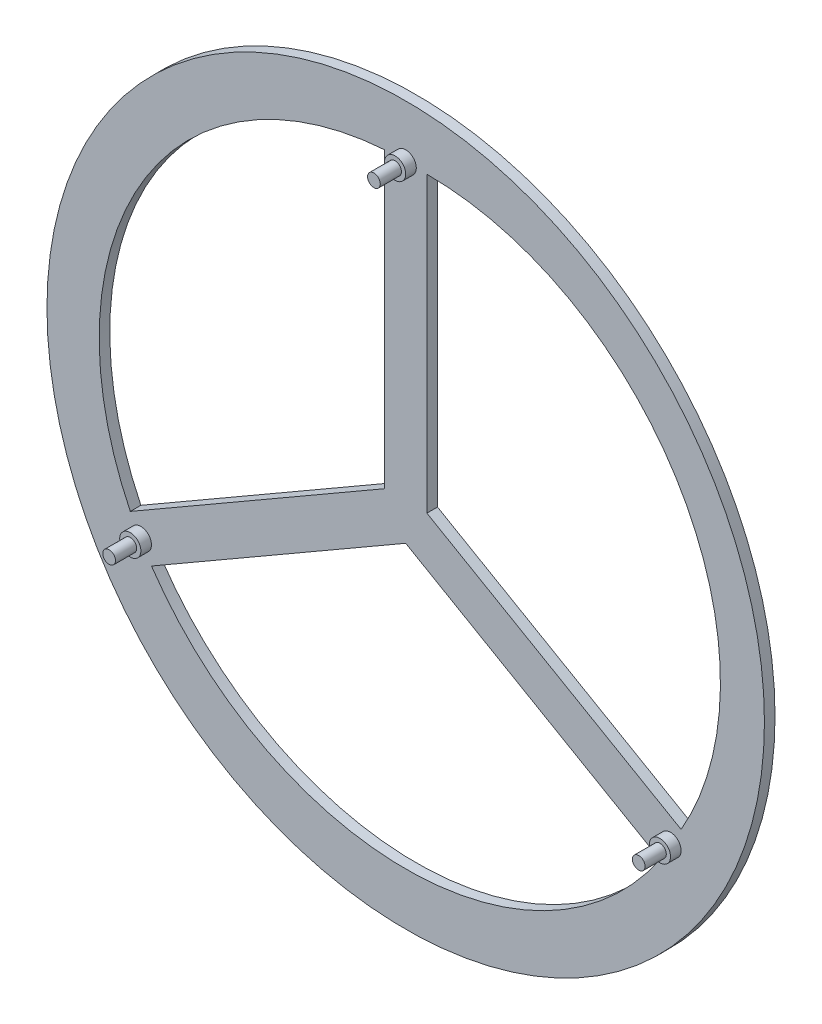
ISO-10303-21;
HEADER;
FILE_DESCRIPTION(('STEP AP214'),'2;1');
FILE_NAME('part.step','',(''),(''),'','','');
FILE_SCHEMA(('AUTOMOTIVE_DESIGN { 1 0 10303 214 1 1 1 1 }'));
ENDSEC;
DATA;
#1=APPLICATION_CONTEXT('core data for automotive mechanical design processes');
#2=APPLICATION_PROTOCOL_DEFINITION('international standard','automotive_design',2000,#1);
#3=PRODUCT_CONTEXT('',#1,'mechanical');
#4=PRODUCT('Part','Part','',(#3));
#5=PRODUCT_RELATED_PRODUCT_CATEGORY('part','',(#4));
#6=PRODUCT_DEFINITION_FORMATION('','',#4);
#7=PRODUCT_DEFINITION_CONTEXT('part definition',#1,'design');
#8=PRODUCT_DEFINITION('design','',#6,#7);
#9=PRODUCT_DEFINITION_SHAPE('','',#8);
#10=(LENGTH_UNIT() NAMED_UNIT(*) SI_UNIT(.MILLI.,.METRE.));
#11=(NAMED_UNIT(*) PLANE_ANGLE_UNIT() SI_UNIT($,.RADIAN.));
#12=(NAMED_UNIT(*) SI_UNIT($,.STERADIAN.) SOLID_ANGLE_UNIT());
#13=UNCERTAINTY_MEASURE_WITH_UNIT(LENGTH_MEASURE(1.E-05),#10,'distance_accuracy_value','');
#14=(GEOMETRIC_REPRESENTATION_CONTEXT(3) GLOBAL_UNCERTAINTY_ASSIGNED_CONTEXT((#13)) GLOBAL_UNIT_ASSIGNED_CONTEXT((#10,
#11,#12)) REPRESENTATION_CONTEXT('',''));
#15=CARTESIAN_POINT('',(0.,0.,0.));
#16=DIRECTION('',(0.,0.,1.));
#17=DIRECTION('',(1.,0.,0.));
#18=AXIS2_PLACEMENT_3D('',#15,#16,#17);
#19=CARTESIAN_POINT('',(-135.538575845274,234.759699749543,10.));
#20=DIRECTION('',(0.5,-0.866025403784439,0.));
#21=DIRECTION('',(0.866025403784439,0.5,0.));
#22=AXIS2_PLACEMENT_3D('',#19,#20,#21);
#23=PLANE('',#22);
#24=DIRECTION('',(-0.866025403784439,-0.5,0.));
#25=VECTOR('',#24,1.);
#26=CARTESIAN_POINT('',(-135.538575845274,234.759699749543,0.));
#27=LINE('',#26,#25);
#28=CARTESIAN_POINT('',(-41.9944651266869,288.767417254023,0.));
#29=VERTEX_POINT('',#28);
#30=CARTESIAN_POINT('',(-281.994465126687,150.203352648513,0.));
#31=VERTEX_POINT('',#30);
#32=EDGE_CURVE('E125',#29,#31,#27,.T.);
#33=ORIENTED_EDGE('',*,*,#32,.T.);
#34=DIRECTION('',(0.,0.,-1.));
#35=VECTOR('',#34,1.);
#36=CARTESIAN_POINT('',(-281.994465126687,150.203352648513,10.));
#37=LINE('',#36,#35);
#38=CARTESIAN_POINT('',(-281.994465126687,150.203352648513,10.));
#39=VERTEX_POINT('',#38);
#40=EDGE_CURVE('E11',#39,#31,#37,.T.);
#41=ORIENTED_EDGE('',*,*,#40,.F.);
#42=DIRECTION('',(-0.866025403784439,-0.5,0.));
#43=VECTOR('',#42,1.);
#44=CARTESIAN_POINT('',(-135.538575845274,234.759699749543,10.));
#45=LINE('',#44,#43);
#46=CARTESIAN_POINT('',(-41.9944651266869,288.767417254023,10.));
#47=VERTEX_POINT('',#46);
#48=EDGE_CURVE('E120',#47,#39,#45,.T.);
#49=ORIENTED_EDGE('',*,*,#48,.F.);
#50=DIRECTION('',(0.,0.,-1.));
#51=VECTOR('',#50,1.);
#52=CARTESIAN_POINT('',(-41.9944651266869,288.767417254023,10.));
#53=LINE('',#52,#51);
#54=EDGE_CURVE('E54',#47,#29,#53,.T.);
#55=ORIENTED_EDGE('',*,*,#54,.T.);
#56=EDGE_LOOP('',(#33,#41,#49,#55));
#57=FACE_BOUND('',#56,.T.);
#58=ADVANCED_FACE('F35',(#57),#23,.F.);
#59=CARTESIAN_POINT('',(-21.9944651266869,277.220411870231,10.));
#60=DIRECTION('',(0.,0.,-1.));
#61=DIRECTION('',(-1.,0.,0.));
#62=AXIS2_PLACEMENT_3D('',#59,#60,#61);
#63=CYLINDRICAL_SURFACE('',#62,289.367125522809);
#64=CARTESIAN_POINT('',(-21.9944651266869,277.220411870231,0.));
#65=DIRECTION('',(0.,0.,1.));
#66=DIRECTION('',(1.,0.,0.));
#67=AXIS2_PLACEMENT_3D('',#64,#65,#66);
#68=CIRCLE('',#67,289.367125522809);
#69=CARTESIAN_POINT('',(-41.9944651266869,565.895546465044,0.));
#70=VERTEX_POINT('',#69);
#71=EDGE_CURVE('E128',#31,#70,#68,.F.);
#72=ORIENTED_EDGE('',*,*,#71,.T.);
#73=DIRECTION('',(0.,0.,-1.));
#74=VECTOR('',#73,1.);
#75=CARTESIAN_POINT('',(-41.9944651266869,565.895546465044,10.));
#76=LINE('',#75,#74);
#77=CARTESIAN_POINT('',(-41.9944651266869,565.895546465044,10.));
#78=VERTEX_POINT('',#77);
#79=EDGE_CURVE('E45',#78,#70,#76,.T.);
#80=ORIENTED_EDGE('',*,*,#79,.F.);
#81=CARTESIAN_POINT('',(-21.9944651266869,277.220411870231,10.));
#82=DIRECTION('',(0.,0.,1.));
#83=DIRECTION('',(1.,0.,0.));
#84=AXIS2_PLACEMENT_3D('',#81,#82,#83);
#85=CIRCLE('',#84,289.367125522809);
#86=EDGE_CURVE('E113',#39,#78,#85,.F.);
#87=ORIENTED_EDGE('',*,*,#86,.F.);
#88=ORIENTED_EDGE('',*,*,#40,.T.);
#89=EDGE_LOOP('',(#72,#80,#87,#88));
#90=FACE_BOUND('',#89,.T.);
#91=ADVANCED_FACE('F115',(#90),#63,.F.);
#92=CARTESIAN_POINT('',(-1.99446512668691,288.767417254023,10.));
#93=DIRECTION('',(0.,0.,-1.));
#94=DIRECTION('',(-1.,0.,0.));
#95=AXIS2_PLACEMENT_3D('',#92,#93,#94);
#96=CYLINDRICAL_SURFACE('',#95,277.12812921102);
#97=CARTESIAN_POINT('',(-1.99446512668691,288.767417254023,0.));
#98=DIRECTION('',(0.,0.,1.));
#99=DIRECTION('',(1.,0.,0.));
#100=AXIS2_PLACEMENT_3D('',#97,#98,#99);
#101=CIRCLE('',#100,277.12812921102);
#102=CARTESIAN_POINT('',(238.005534873313,150.203352648513,0.));
#103=VERTEX_POINT('',#102);
#104=CARTESIAN_POINT('',(-1.99446512668691,565.895546465044,0.));
#105=VERTEX_POINT('',#104);
#106=EDGE_CURVE('E213',#103,#105,#101,.T.);
#107=ORIENTED_EDGE('',*,*,#106,.F.);
#108=DIRECTION('',(0.,0.,-1.));
#109=VECTOR('',#108,1.);
#110=CARTESIAN_POINT('',(238.005534873313,150.203352648513,10.));
#111=LINE('',#110,#109);
#112=CARTESIAN_POINT('',(238.005534873313,150.203352648513,10.));
#113=VERTEX_POINT('',#112);
#114=EDGE_CURVE('E141',#113,#103,#111,.T.);
#115=ORIENTED_EDGE('',*,*,#114,.F.);
#116=CARTESIAN_POINT('',(-1.99446512668691,288.767417254023,10.));
#117=DIRECTION('',(0.,0.,1.));
#118=DIRECTION('',(1.,0.,0.));
#119=AXIS2_PLACEMENT_3D('',#116,#117,#118);
#120=CIRCLE('',#119,277.12812921102);
#121=CARTESIAN_POINT('',(-1.99446512668691,565.895546465044,10.));
#122=VERTEX_POINT('',#121);
#123=EDGE_CURVE('E194',#113,#122,#120,.T.);
#124=ORIENTED_EDGE('',*,*,#123,.T.);
#125=DIRECTION('',(0.,0.,-1.));
#126=VECTOR('',#125,1.);
#127=CARTESIAN_POINT('',(-1.99446512668691,565.895546465044,10.));
#128=LINE('',#127,#126);
#129=EDGE_CURVE('E143',#122,#105,#128,.T.);
#130=ORIENTED_EDGE('',*,*,#129,.T.);
#131=EDGE_LOOP('',(#107,#115,#124,#130));
#132=FACE_BOUND('',#131,.T.);
#133=ADVANCED_FACE('F230',(#132),#96,.F.);
#134=CARTESIAN_POINT('',(124.541343281931,215.711934207181,10.));
#135=DIRECTION('',(0.5,0.866025403784439,0.));
#136=DIRECTION('',(-0.866025403784439,0.5,0.));
#137=AXIS2_PLACEMENT_3D('',#134,#135,#136);
#138=PLANE('',#137);
#139=DIRECTION('',(0.866025403784439,-0.5,0.));
#140=VECTOR('',#139,1.);
#141=CARTESIAN_POINT('',(124.541343281931,215.711934207181,0.));
#142=LINE('',#141,#140);
#143=CARTESIAN_POINT('',(-1.99446512668691,288.767417254023,0.));
#144=VERTEX_POINT('',#143);
#145=EDGE_CURVE('E216',#144,#103,#142,.T.);
#146=ORIENTED_EDGE('',*,*,#145,.F.);
#147=DIRECTION('',(0.,0.,-1.));
#148=VECTOR('',#147,1.);
#149=CARTESIAN_POINT('',(-1.99446512668691,288.767417254023,10.));
#150=LINE('',#149,#148);
#151=CARTESIAN_POINT('',(-1.99446512668691,288.767417254023,10.));
#152=VERTEX_POINT('',#151);
#153=EDGE_CURVE('E145',#152,#144,#150,.T.);
#154=ORIENTED_EDGE('',*,*,#153,.F.);
#155=DIRECTION('',(0.866025403784439,-0.5,0.));
#156=VECTOR('',#155,1.);
#157=CARTESIAN_POINT('',(124.541343281931,215.711934207181,10.));
#158=LINE('',#157,#156);
#159=EDGE_CURVE('E197',#152,#113,#158,.T.);
#160=ORIENTED_EDGE('',*,*,#159,.T.);
#161=ORIENTED_EDGE('',*,*,#114,.T.);
#162=EDGE_LOOP('',(#146,#154,#160,#161));
#163=FACE_BOUND('',#162,.T.);
#164=ADVANCED_FACE('F236',(#163),#138,.T.);
#165=CARTESIAN_POINT('',(-21.9944651266869,277.220411870231,10.));
#166=DIRECTION('',(0.,0.,-1.));
#167=DIRECTION('',(-1.,0.,0.));
#168=AXIS2_PLACEMENT_3D('',#165,#166,#167);
#169=CYLINDRICAL_SURFACE('',#168,289.367125522809);
#170=CARTESIAN_POINT('',(-21.9944651266869,277.220411870231,0.));
#171=DIRECTION('',(0.,0.,1.));
#172=DIRECTION('',(1.,0.,0.));
#173=AXIS2_PLACEMENT_3D('',#170,#171,#172);
#174=CIRCLE('',#173,289.367125522809);
#175=CARTESIAN_POINT('',(-261.994465126687,115.562336497136,0.));
#176=VERTEX_POINT('',#175);
#177=CARTESIAN_POINT('',(218.005534873313,115.562336497136,0.));
#178=VERTEX_POINT('',#177);
#179=EDGE_CURVE('E187',#176,#178,#174,.T.);
#180=ORIENTED_EDGE('',*,*,#179,.F.);
#181=DIRECTION('',(0.,0.,-1.));
#182=VECTOR('',#181,1.);
#183=CARTESIAN_POINT('',(-261.994465126687,115.562336497136,10.));
#184=LINE('',#183,#182);
#185=CARTESIAN_POINT('',(-261.994465126687,115.562336497136,10.));
#186=VERTEX_POINT('',#185);
#187=EDGE_CURVE('E95',#186,#176,#184,.T.);
#188=ORIENTED_EDGE('',*,*,#187,.F.);
#189=CARTESIAN_POINT('',(-21.9944651266869,277.220411870231,10.));
#190=DIRECTION('',(0.,0.,1.));
#191=DIRECTION('',(1.,0.,0.));
#192=AXIS2_PLACEMENT_3D('',#189,#190,#191);
#193=CIRCLE('',#192,289.367125522809);
#194=CARTESIAN_POINT('',(218.005534873313,115.562336497136,10.));
#195=VERTEX_POINT('',#194);
#196=EDGE_CURVE('E139',#186,#195,#193,.T.);
#197=ORIENTED_EDGE('',*,*,#196,.T.);
#198=DIRECTION('',(0.,0.,-1.));
#199=VECTOR('',#198,1.);
#200=CARTESIAN_POINT('',(218.005534873313,115.562336497136,10.));
#201=LINE('',#200,#199);
#202=EDGE_CURVE('E148',#195,#178,#201,.T.);
#203=ORIENTED_EDGE('',*,*,#202,.T.);
#204=EDGE_LOOP('',(#180,#188,#197,#203));
#205=FACE_BOUND('',#204,.T.);
#206=ADVANCED_FACE('F37',(#205),#169,.F.);
#207=CARTESIAN_POINT('',(-115.538575845274,200.118683598165,10.));
#208=DIRECTION('',(0.5,-0.866025403784438,0.));
#209=DIRECTION('',(0.866025403784439,0.5,0.));
#210=AXIS2_PLACEMENT_3D('',#207,#208,#209);
#211=PLANE('',#210);
#212=DIRECTION('',(-0.866025403784439,-0.5,0.));
#213=VECTOR('',#212,1.);
#214=CARTESIAN_POINT('',(-115.538575845274,200.118683598165,0.));
#215=LINE('',#214,#213);
#216=CARTESIAN_POINT('',(-21.9944651266869,254.126401102646,0.));
#217=VERTEX_POINT('',#216);
#218=EDGE_CURVE('E207',#217,#176,#215,.T.);
#219=ORIENTED_EDGE('',*,*,#218,.F.);
#220=DIRECTION('',(0.,0.,-1.));
#221=VECTOR('',#220,1.);
#222=CARTESIAN_POINT('',(-21.9944651266869,254.126401102646,10.));
#223=LINE('',#222,#221);
#224=CARTESIAN_POINT('',(-21.9944651266869,254.126401102646,10.));
#225=VERTEX_POINT('',#224);
#226=EDGE_CURVE('E150',#225,#217,#223,.T.);
#227=ORIENTED_EDGE('',*,*,#226,.F.);
#228=DIRECTION('',(-0.866025403784439,-0.5,0.));
#229=VECTOR('',#228,1.);
#230=CARTESIAN_POINT('',(-115.538575845274,200.118683598165,10.));
#231=LINE('',#230,#229);
#232=EDGE_CURVE('E189',#225,#186,#231,.T.);
#233=ORIENTED_EDGE('',*,*,#232,.T.);
#234=ORIENTED_EDGE('',*,*,#187,.T.);
#235=EDGE_LOOP('',(#219,#227,#233,#234));
#236=FACE_BOUND('',#235,.T.);
#237=ADVANCED_FACE('F243',(#236),#211,.T.);
#238=CARTESIAN_POINT('',(-21.9944651266869,277.220411870231,10.));
#239=DIRECTION('',(0.,0.,-1.));
#240=DIRECTION('',(-1.,0.,0.));
#241=AXIS2_PLACEMENT_3D('',#238,#239,#240);
#242=CYLINDRICAL_SURFACE('',#241,338.675134594814);
#243=CARTESIAN_POINT('',(-21.9944651266869,277.220411870231,10.));
#244=DIRECTION('',(0.,0.,1.));
#245=DIRECTION('',(1.,0.,0.));
#246=AXIS2_PLACEMENT_3D('',#243,#244,#245);
#247=CIRCLE('',#246,338.675134594814);
#248=CARTESIAN_POINT('',(316.680669468127,277.220411870231,10.));
#249=VERTEX_POINT('',#248);
#250=EDGE_CURVE('E123',#249,#249,#247,.T.);
#251=ORIENTED_EDGE('',*,*,#250,.F.);
#252=EDGE_LOOP('',(#251));
#253=FACE_BOUND('',#252,.T.);
#254=CARTESIAN_POINT('',(-21.9944651266869,277.220411870231,0.));
#255=DIRECTION('',(0.,0.,1.));
#256=DIRECTION('',(1.,0.,0.));
#257=AXIS2_PLACEMENT_3D('',#254,#255,#256);
#258=CIRCLE('',#257,338.675134594814);
#259=CARTESIAN_POINT('',(316.680669468127,277.220411870231,0.));
#260=VERTEX_POINT('',#259);
#261=EDGE_CURVE('E129',#260,#260,#258,.T.);
#262=ORIENTED_EDGE('',*,*,#261,.T.);
#263=EDGE_LOOP('',(#262));
#264=FACE_BOUND('',#263,.T.);
#265=ADVANCED_FACE('F254',(#253,#264),#242,.T.);
#266=CARTESIAN_POINT('',(-1.99446512668691,0.,10.));
#267=DIRECTION('',(-1.,0.,0.));
#268=DIRECTION('',(0.,0.,1.));
#269=AXIS2_PLACEMENT_3D('',#266,#267,#268);
#270=PLANE('',#269);
#271=DIRECTION('',(0.,1.,0.));
#272=VECTOR('',#271,1.);
#273=CARTESIAN_POINT('',(-1.99446512668691,0.,0.));
#274=LINE('',#273,#272);
#275=EDGE_CURVE('E134',#144,#105,#274,.T.);
#276=ORIENTED_EDGE('',*,*,#275,.T.);
#277=ORIENTED_EDGE('',*,*,#129,.F.);
#278=DIRECTION('',(0.,1.,0.));
#279=VECTOR('',#278,1.);
#280=CARTESIAN_POINT('',(-1.99446512668691,0.,10.));
#281=LINE('',#280,#279);
#282=EDGE_CURVE('E200',#152,#122,#281,.T.);
#283=ORIENTED_EDGE('',*,*,#282,.F.);
#284=ORIENTED_EDGE('',*,*,#153,.T.);
#285=EDGE_LOOP('',(#276,#277,#283,#284));
#286=FACE_BOUND('',#285,.T.);
#287=ADVANCED_FACE('F222',(#286),#270,.F.);
#288=CARTESIAN_POINT('',(104.541343281931,181.070918055803,10.));
#289=DIRECTION('',(0.5,0.866025403784438,0.));
#290=DIRECTION('',(-0.866025403784439,0.5,0.));
#291=AXIS2_PLACEMENT_3D('',#288,#289,#290);
#292=PLANE('',#291);
#293=DIRECTION('',(0.866025403784439,-0.5,0.));
#294=VECTOR('',#293,1.);
#295=CARTESIAN_POINT('',(104.541343281931,181.070918055803,0.));
#296=LINE('',#295,#294);
#297=EDGE_CURVE('E210',#217,#178,#296,.T.);
#298=ORIENTED_EDGE('',*,*,#297,.T.);
#299=ORIENTED_EDGE('',*,*,#202,.F.);
#300=DIRECTION('',(0.866025403784439,-0.5,0.));
#301=VECTOR('',#300,1.);
#302=CARTESIAN_POINT('',(104.541343281931,181.070918055803,10.));
#303=LINE('',#302,#301);
#304=EDGE_CURVE('E192',#225,#195,#303,.T.);
#305=ORIENTED_EDGE('',*,*,#304,.F.);
#306=ORIENTED_EDGE('',*,*,#226,.T.);
#307=EDGE_LOOP('',(#298,#299,#305,#306));
#308=FACE_BOUND('',#307,.T.);
#309=ADVANCED_FACE('F258',(#308),#292,.F.);
#310=CARTESIAN_POINT('',(-41.9944651266869,0.,10.));
#311=DIRECTION('',(-1.,0.,0.));
#312=DIRECTION('',(0.,0.,1.));
#313=AXIS2_PLACEMENT_3D('',#310,#311,#312);
#314=PLANE('',#313);
#315=DIRECTION('',(0.,1.,0.));
#316=VECTOR('',#315,1.);
#317=CARTESIAN_POINT('',(-41.9944651266869,0.,0.));
#318=LINE('',#317,#316);
#319=EDGE_CURVE('E131',#29,#70,#318,.T.);
#320=ORIENTED_EDGE('',*,*,#319,.F.);
#321=ORIENTED_EDGE('',*,*,#54,.F.);
#322=DIRECTION('',(0.,1.,0.));
#323=VECTOR('',#322,1.);
#324=CARTESIAN_POINT('',(-41.9944651266869,0.,10.));
#325=LINE('',#324,#323);
#326=EDGE_CURVE('E119',#47,#78,#325,.T.);
#327=ORIENTED_EDGE('',*,*,#326,.T.);
#328=ORIENTED_EDGE('',*,*,#79,.T.);
#329=EDGE_LOOP('',(#320,#321,#327,#328));
#330=FACE_BOUND('',#329,.T.);
#331=ADVANCED_FACE('F262',(#330),#314,.T.);
#332=CARTESIAN_POINT('',(0.,0.,10.));
#333=DIRECTION('',(0.,0.,1.));
#334=DIRECTION('',(1.,0.,0.));
#335=AXIS2_PLACEMENT_3D('',#332,#333,#334);
#336=PLANE('',#335);
#337=CARTESIAN_POINT('',(-271.994465126687,132.882844572824,10.));
#338=DIRECTION('',(0.,0.,1.));
#339=DIRECTION('',(1.,0.,0.));
#340=AXIS2_PLACEMENT_3D('',#337,#338,#339);
#341=CIRCLE('',#340,10.);
#342=CARTESIAN_POINT('',(-261.994465126687,132.882844572824,10.));
#343=VERTEX_POINT('',#342);
#344=EDGE_CURVE('E166',#343,#343,#341,.F.);
#345=ORIENTED_EDGE('',*,*,#344,.T.);
#346=EDGE_LOOP('',(#345));
#347=FACE_BOUND('',#346,.T.);
#348=CARTESIAN_POINT('',(228.005534873313,132.882844572824,10.));
#349=DIRECTION('',(0.,0.,1.));
#350=DIRECTION('',(1.,0.,0.));
#351=AXIS2_PLACEMENT_3D('',#348,#349,#350);
#352=CIRCLE('',#351,10.);
#353=CARTESIAN_POINT('',(238.005534873313,132.882844572824,10.));
#354=VERTEX_POINT('',#353);
#355=EDGE_CURVE('E159',#354,#354,#352,.F.);
#356=ORIENTED_EDGE('',*,*,#355,.T.);
#357=EDGE_LOOP('',(#356));
#358=FACE_BOUND('',#357,.T.);
#359=CARTESIAN_POINT('',(-21.9944651266869,565.895546465044,10.));
#360=DIRECTION('',(0.,0.,1.));
#361=DIRECTION('',(1.,0.,0.));
#362=AXIS2_PLACEMENT_3D('',#359,#360,#361);
#363=CIRCLE('',#362,10.);
#364=CARTESIAN_POINT('',(-11.9944651266869,565.895546465044,10.));
#365=VERTEX_POINT('',#364);
#366=EDGE_CURVE('E155',#365,#365,#363,.F.);
#367=ORIENTED_EDGE('',*,*,#366,.T.);
#368=EDGE_LOOP('',(#367));
#369=FACE_BOUND('',#368,.T.);
#370=ORIENTED_EDGE('',*,*,#196,.F.);
#371=ORIENTED_EDGE('',*,*,#232,.F.);
#372=ORIENTED_EDGE('',*,*,#304,.T.);
#373=EDGE_LOOP('',(#370,#371,#372));
#374=FACE_BOUND('',#373,.T.);
#375=ORIENTED_EDGE('',*,*,#123,.F.);
#376=ORIENTED_EDGE('',*,*,#159,.F.);
#377=ORIENTED_EDGE('',*,*,#282,.T.);
#378=EDGE_LOOP('',(#375,#376,#377));
#379=FACE_BOUND('',#378,.T.);
#380=ORIENTED_EDGE('',*,*,#250,.T.);
#381=EDGE_LOOP('',(#380));
#382=FACE_BOUND('',#381,.T.);
#383=ORIENTED_EDGE('',*,*,#48,.T.);
#384=ORIENTED_EDGE('',*,*,#86,.T.);
#385=ORIENTED_EDGE('',*,*,#326,.F.);
#386=EDGE_LOOP('',(#383,#384,#385));
#387=FACE_BOUND('',#386,.T.);
#388=ADVANCED_FACE('F122',(#347,#358,#369,#374,#379,#382,#387),#336,.T.);
#389=CARTESIAN_POINT('',(0.,0.,0.));
#390=DIRECTION('',(0.,0.,1.));
#391=DIRECTION('',(1.,0.,0.));
#392=AXIS2_PLACEMENT_3D('',#389,#390,#391);
#393=PLANE('',#392);
#394=ORIENTED_EDGE('',*,*,#179,.T.);
#395=ORIENTED_EDGE('',*,*,#297,.F.);
#396=ORIENTED_EDGE('',*,*,#218,.T.);
#397=EDGE_LOOP('',(#394,#395,#396));
#398=FACE_BOUND('',#397,.T.);
#399=ORIENTED_EDGE('',*,*,#106,.T.);
#400=ORIENTED_EDGE('',*,*,#275,.F.);
#401=ORIENTED_EDGE('',*,*,#145,.T.);
#402=EDGE_LOOP('',(#399,#400,#401));
#403=FACE_BOUND('',#402,.T.);
#404=ORIENTED_EDGE('',*,*,#261,.F.);
#405=EDGE_LOOP('',(#404));
#406=FACE_BOUND('',#405,.T.);
#407=ORIENTED_EDGE('',*,*,#32,.F.);
#408=ORIENTED_EDGE('',*,*,#319,.T.);
#409=ORIENTED_EDGE('',*,*,#71,.F.);
#410=EDGE_LOOP('',(#407,#408,#409));
#411=FACE_BOUND('',#410,.T.);
#412=ADVANCED_FACE('F227',(#398,#403,#406,#411),#393,.F.);
#413=CARTESIAN_POINT('',(-21.9944651266869,565.895546465044,20.));
#414=DIRECTION('',(0.,0.,-1.));
#415=DIRECTION('',(-1.,0.,0.));
#416=AXIS2_PLACEMENT_3D('',#413,#414,#415);
#417=CYLINDRICAL_SURFACE('',#416,10.);
#418=ORIENTED_EDGE('',*,*,#366,.F.);
#419=EDGE_LOOP('',(#418));
#420=FACE_BOUND('',#419,.T.);
#421=CARTESIAN_POINT('',(-21.9944651266869,565.895546465044,20.));
#422=DIRECTION('',(0.,0.,1.));
#423=DIRECTION('',(1.,0.,0.));
#424=AXIS2_PLACEMENT_3D('',#421,#422,#423);
#425=CIRCLE('',#424,10.);
#426=CARTESIAN_POINT('',(-11.9944651266869,565.895546465044,20.));
#427=VERTEX_POINT('',#426);
#428=EDGE_CURVE('E156',#427,#427,#425,.T.);
#429=ORIENTED_EDGE('',*,*,#428,.F.);
#430=EDGE_LOOP('',(#429));
#431=FACE_BOUND('',#430,.T.);
#432=ADVANCED_FACE('F285',(#420,#431),#417,.T.);
#433=CARTESIAN_POINT('',(-21.9944651266869,565.895546465044,20.));
#434=DIRECTION('',(0.,0.,1.));
#435=DIRECTION('',(1.,0.,0.));
#436=AXIS2_PLACEMENT_3D('',#433,#434,#435);
#437=PLANE('',#436);
#438=CARTESIAN_POINT('',(-21.9944651266869,565.895546465044,20.));
#439=DIRECTION('',(0.,0.,1.));
#440=DIRECTION('',(1.,0.,0.));
#441=AXIS2_PLACEMENT_3D('',#438,#439,#440);
#442=CIRCLE('',#441,6.);
#443=CARTESIAN_POINT('',(-15.9944651266869,565.895546465044,20.));
#444=VERTEX_POINT('',#443);
#445=EDGE_CURVE('E153',#444,#444,#442,.T.);
#446=ORIENTED_EDGE('',*,*,#445,.F.);
#447=EDGE_LOOP('',(#446));
#448=FACE_BOUND('',#447,.T.);
#449=ORIENTED_EDGE('',*,*,#428,.T.);
#450=EDGE_LOOP('',(#449));
#451=FACE_BOUND('',#450,.T.);
#452=ADVANCED_FACE('F302',(#448,#451),#437,.T.);
#453=CARTESIAN_POINT('',(-21.9944651266869,565.895546465044,40.));
#454=DIRECTION('',(0.,0.,1.));
#455=DIRECTION('',(1.,0.,0.));
#456=AXIS2_PLACEMENT_3D('',#453,#454,#455);
#457=PLANE('',#456);
#458=CARTESIAN_POINT('',(-21.9944651266869,565.895546465044,40.));
#459=DIRECTION('',(0.,0.,1.));
#460=DIRECTION('',(1.,0.,0.));
#461=AXIS2_PLACEMENT_3D('',#458,#459,#460);
#462=CIRCLE('',#461,6.);
#463=CARTESIAN_POINT('',(-15.9944651266869,565.895546465044,40.));
#464=VERTEX_POINT('',#463);
#465=EDGE_CURVE('E181',#464,#464,#462,.T.);
#466=ORIENTED_EDGE('',*,*,#465,.T.);
#467=EDGE_LOOP('',(#466));
#468=FACE_BOUND('',#467,.T.);
#469=ADVANCED_FACE('F298',(#468),#457,.T.);
#470=CARTESIAN_POINT('',(-21.9944651266869,565.895546465044,40.));
#471=DIRECTION('',(0.,0.,-1.));
#472=DIRECTION('',(-1.,0.,0.));
#473=AXIS2_PLACEMENT_3D('',#470,#471,#472);
#474=CYLINDRICAL_SURFACE('',#473,6.);
#475=ORIENTED_EDGE('',*,*,#445,.T.);
#476=EDGE_LOOP('',(#475));
#477=FACE_BOUND('',#476,.T.);
#478=ORIENTED_EDGE('',*,*,#465,.F.);
#479=EDGE_LOOP('',(#478));
#480=FACE_BOUND('',#479,.T.);
#481=ADVANCED_FACE('F301',(#477,#480),#474,.T.);
#482=CARTESIAN_POINT('',(228.005534873313,132.882844572824,20.));
#483=DIRECTION('',(0.,0.,-1.));
#484=DIRECTION('',(-1.,0.,0.));
#485=AXIS2_PLACEMENT_3D('',#482,#483,#484);
#486=CYLINDRICAL_SURFACE('',#485,10.);
#487=ORIENTED_EDGE('',*,*,#355,.F.);
#488=EDGE_LOOP('',(#487));
#489=FACE_BOUND('',#488,.T.);
#490=CARTESIAN_POINT('',(228.005534873313,132.882844572824,20.));
#491=DIRECTION('',(0.,0.,1.));
#492=DIRECTION('',(1.,0.,0.));
#493=AXIS2_PLACEMENT_3D('',#490,#491,#492);
#494=CIRCLE('',#493,10.);
#495=CARTESIAN_POINT('',(238.005534873313,132.882844572824,20.));
#496=VERTEX_POINT('',#495);
#497=EDGE_CURVE('E160',#496,#496,#494,.T.);
#498=ORIENTED_EDGE('',*,*,#497,.F.);
#499=EDGE_LOOP('',(#498));
#500=FACE_BOUND('',#499,.T.);
#501=ADVANCED_FACE('F306',(#489,#500),#486,.T.);
#502=CARTESIAN_POINT('',(228.005534873313,132.882844572824,20.));
#503=DIRECTION('',(0.,0.,1.));
#504=DIRECTION('',(1.,0.,0.));
#505=AXIS2_PLACEMENT_3D('',#502,#503,#504);
#506=PLANE('',#505);
#507=CARTESIAN_POINT('',(228.005534873313,132.882844572824,20.));
#508=DIRECTION('',(0.,0.,1.));
#509=DIRECTION('',(1.,0.,0.));
#510=AXIS2_PLACEMENT_3D('',#507,#508,#509);
#511=CIRCLE('',#510,6.00000000000002);
#512=CARTESIAN_POINT('',(234.005534873313,132.882844572824,20.));
#513=VERTEX_POINT('',#512);
#514=EDGE_CURVE('E157',#513,#513,#511,.T.);
#515=ORIENTED_EDGE('',*,*,#514,.F.);
#516=EDGE_LOOP('',(#515));
#517=FACE_BOUND('',#516,.T.);
#518=ORIENTED_EDGE('',*,*,#497,.T.);
#519=EDGE_LOOP('',(#518));
#520=FACE_BOUND('',#519,.T.);
#521=ADVANCED_FACE('F296',(#517,#520),#506,.T.);
#522=CARTESIAN_POINT('',(228.005534873313,132.882844572824,40.));
#523=DIRECTION('',(0.,0.,1.));
#524=DIRECTION('',(1.,0.,0.));
#525=AXIS2_PLACEMENT_3D('',#522,#523,#524);
#526=PLANE('',#525);
#527=CARTESIAN_POINT('',(228.005534873313,132.882844572824,40.));
#528=DIRECTION('',(0.,0.,1.));
#529=DIRECTION('',(1.,0.,0.));
#530=AXIS2_PLACEMENT_3D('',#527,#528,#529);
#531=CIRCLE('',#530,6.00000000000002);
#532=CARTESIAN_POINT('',(234.005534873313,132.882844572824,40.));
#533=VERTEX_POINT('',#532);
#534=EDGE_CURVE('E184',#533,#533,#531,.T.);
#535=ORIENTED_EDGE('',*,*,#534,.T.);
#536=EDGE_LOOP('',(#535));
#537=FACE_BOUND('',#536,.T.);
#538=ADVANCED_FACE('F293',(#537),#526,.T.);
#539=CARTESIAN_POINT('',(228.005534873313,132.882844572824,40.));
#540=DIRECTION('',(0.,0.,-1.));
#541=DIRECTION('',(-1.,0.,0.));
#542=AXIS2_PLACEMENT_3D('',#539,#540,#541);
#543=CYLINDRICAL_SURFACE('',#542,6.00000000000002);
#544=ORIENTED_EDGE('',*,*,#514,.T.);
#545=EDGE_LOOP('',(#544));
#546=FACE_BOUND('',#545,.T.);
#547=ORIENTED_EDGE('',*,*,#534,.F.);
#548=EDGE_LOOP('',(#547));
#549=FACE_BOUND('',#548,.T.);
#550=ADVANCED_FACE('F289',(#546,#549),#543,.T.);
#551=CARTESIAN_POINT('',(-271.994465126687,132.882844572824,20.));
#552=DIRECTION('',(0.,0.,-1.));
#553=DIRECTION('',(-1.,0.,0.));
#554=AXIS2_PLACEMENT_3D('',#551,#552,#553);
#555=CYLINDRICAL_SURFACE('',#554,10.);
#556=ORIENTED_EDGE('',*,*,#344,.F.);
#557=EDGE_LOOP('',(#556));
#558=FACE_BOUND('',#557,.T.);
#559=CARTESIAN_POINT('',(-271.994465126687,132.882844572824,20.));
#560=DIRECTION('',(0.,0.,1.));
#561=DIRECTION('',(1.,0.,0.));
#562=AXIS2_PLACEMENT_3D('',#559,#560,#561);
#563=CIRCLE('',#562,10.);
#564=CARTESIAN_POINT('',(-261.994465126687,132.882844572824,20.));
#565=VERTEX_POINT('',#564);
#566=EDGE_CURVE('E340',#565,#565,#563,.T.);
#567=ORIENTED_EDGE('',*,*,#566,.F.);
#568=EDGE_LOOP('',(#567));
#569=FACE_BOUND('',#568,.T.);
#570=ADVANCED_FACE('F292',(#558,#569),#555,.T.);
#571=CARTESIAN_POINT('',(-271.994465126687,132.882844572824,20.));
#572=DIRECTION('',(0.,0.,1.));
#573=DIRECTION('',(1.,0.,0.));
#574=AXIS2_PLACEMENT_3D('',#571,#572,#573);
#575=PLANE('',#574);
#576=CARTESIAN_POINT('',(-271.994465126687,132.882844572824,20.));
#577=DIRECTION('',(0.,0.,1.));
#578=DIRECTION('',(1.,0.,0.));
#579=AXIS2_PLACEMENT_3D('',#576,#577,#578);
#580=CIRCLE('',#579,5.99999999999999);
#581=CARTESIAN_POINT('',(-265.994465126687,132.882844572824,20.));
#582=VERTEX_POINT('',#581);
#583=EDGE_CURVE('E39',#582,#582,#580,.T.);
#584=ORIENTED_EDGE('',*,*,#583,.F.);
#585=EDGE_LOOP('',(#584));
#586=FACE_BOUND('',#585,.T.);
#587=ORIENTED_EDGE('',*,*,#566,.T.);
#588=EDGE_LOOP('',(#587));
#589=FACE_BOUND('',#588,.T.);
#590=ADVANCED_FACE('F312',(#586,#589),#575,.T.);
#591=CARTESIAN_POINT('',(-271.994465126687,132.882844572824,40.));
#592=DIRECTION('',(0.,0.,1.));
#593=DIRECTION('',(1.,0.,0.));
#594=AXIS2_PLACEMENT_3D('',#591,#592,#593);
#595=PLANE('',#594);
#596=CARTESIAN_POINT('',(-271.994465126687,132.882844572824,40.));
#597=DIRECTION('',(0.,0.,1.));
#598=DIRECTION('',(1.,0.,0.));
#599=AXIS2_PLACEMENT_3D('',#596,#597,#598);
#600=CIRCLE('',#599,5.99999999999999);
#601=CARTESIAN_POINT('',(-265.994465126687,132.882844572824,40.));
#602=VERTEX_POINT('',#601);
#603=EDGE_CURVE('E178',#602,#602,#600,.T.);
#604=ORIENTED_EDGE('',*,*,#603,.T.);
#605=EDGE_LOOP('',(#604));
#606=FACE_BOUND('',#605,.T.);
#607=ADVANCED_FACE('F308',(#606),#595,.T.);
#608=CARTESIAN_POINT('',(-271.994465126687,132.882844572824,40.));
#609=DIRECTION('',(0.,0.,-1.));
#610=DIRECTION('',(-1.,0.,0.));
#611=AXIS2_PLACEMENT_3D('',#608,#609,#610);
#612=CYLINDRICAL_SURFACE('',#611,5.99999999999999);
#613=ORIENTED_EDGE('',*,*,#583,.T.);
#614=EDGE_LOOP('',(#613));
#615=FACE_BOUND('',#614,.T.);
#616=ORIENTED_EDGE('',*,*,#603,.F.);
#617=EDGE_LOOP('',(#616));
#618=FACE_BOUND('',#617,.T.);
#619=ADVANCED_FACE('F311',(#615,#618),#612,.T.);
#620=CLOSED_SHELL('',(#58,#91,#133,#164,#206,#237,#265,#287,#309,#331,#388,#412,#432,#452,#469,
#481,#501,#521,#538,#550,#570,#590,#607,#619));
#621=MANIFOLD_SOLID_BREP('B2',#620);
#622=ADVANCED_BREP_SHAPE_REPRESENTATION('',(#18,#621),#14);
#623=SHAPE_DEFINITION_REPRESENTATION(#9,#622);
ENDSEC;
END-ISO-10303-21;
